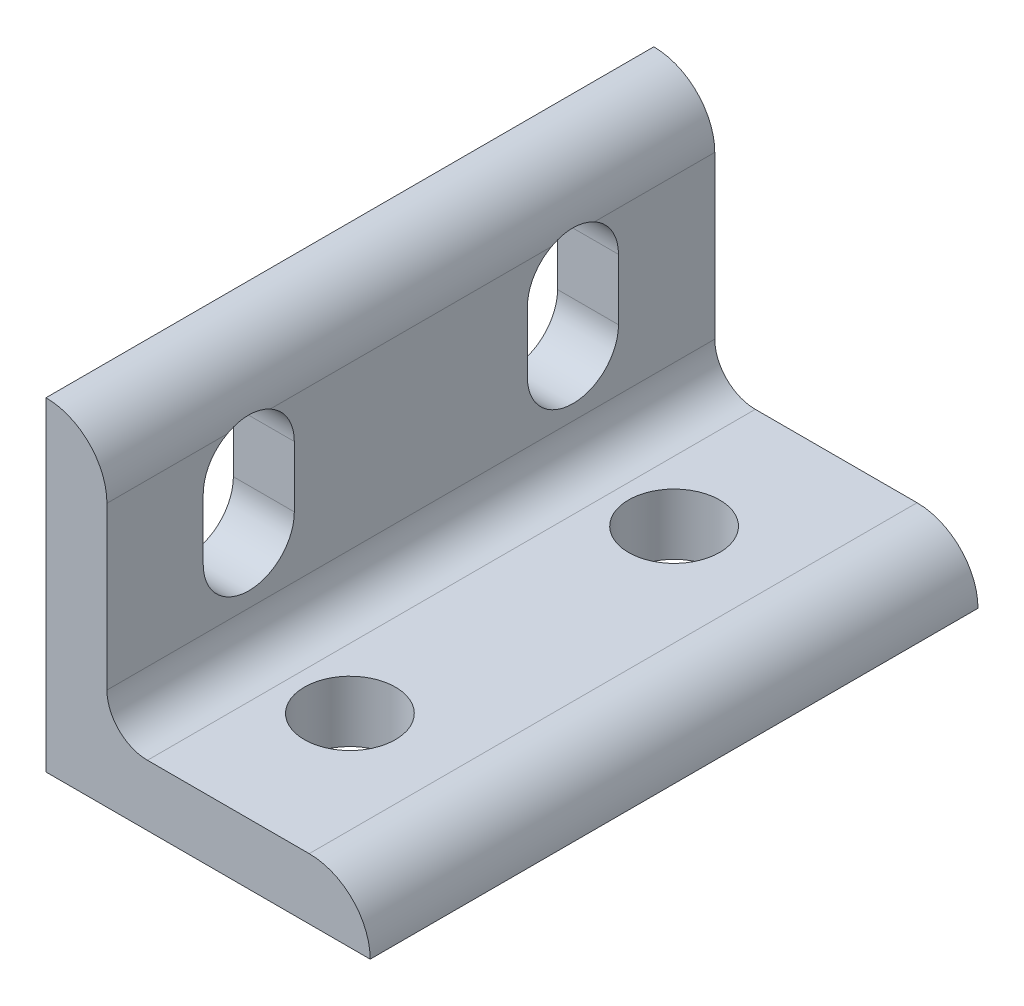
ISO-10303-21;
HEADER;
FILE_DESCRIPTION(('STEP AP214'),'2;1');
FILE_NAME('part.step','',(''),(''),'','','');
FILE_SCHEMA(('AUTOMOTIVE_DESIGN { 1 0 10303 214 1 1 1 1 }'));
ENDSEC;
DATA;
#1=APPLICATION_CONTEXT('core data for automotive mechanical design processes');
#2=APPLICATION_PROTOCOL_DEFINITION('international standard','automotive_design',2000,#1);
#3=PRODUCT_CONTEXT('',#1,'mechanical');
#4=PRODUCT('Part','Part','',(#3));
#5=PRODUCT_RELATED_PRODUCT_CATEGORY('part','',(#4));
#6=PRODUCT_DEFINITION_FORMATION('','',#4);
#7=PRODUCT_DEFINITION_CONTEXT('part definition',#1,'design');
#8=PRODUCT_DEFINITION('design','',#6,#7);
#9=PRODUCT_DEFINITION_SHAPE('','',#8);
#10=(LENGTH_UNIT() NAMED_UNIT(*) SI_UNIT(.MILLI.,.METRE.));
#11=(NAMED_UNIT(*) PLANE_ANGLE_UNIT() SI_UNIT($,.RADIAN.));
#12=(NAMED_UNIT(*) SI_UNIT($,.STERADIAN.) SOLID_ANGLE_UNIT());
#13=UNCERTAINTY_MEASURE_WITH_UNIT(LENGTH_MEASURE(1.E-05),#10,'distance_accuracy_value','');
#14=(GEOMETRIC_REPRESENTATION_CONTEXT(3) GLOBAL_UNCERTAINTY_ASSIGNED_CONTEXT((#13)) GLOBAL_UNIT_ASSIGNED_CONTEXT((#10,
#11,#12)) REPRESENTATION_CONTEXT('',''));
#15=CARTESIAN_POINT('',(0.,0.,0.));
#16=DIRECTION('',(0.,0.,1.));
#17=DIRECTION('',(1.,0.,0.));
#18=AXIS2_PLACEMENT_3D('',#15,#16,#17);
#19=CARTESIAN_POINT('',(-12.7,7.9248,-23.8125));
#20=DIRECTION('',(0.,0.,1.));
#21=DIRECTION('',(1.,0.,0.));
#22=AXIS2_PLACEMENT_3D('',#19,#20,#21);
#23=CYLINDRICAL_SURFACE('',#22,4.7752);
#24=CARTESIAN_POINT('',(-7.9248,7.9248,11.0220132509462));
#25=CARTESIAN_POINT('',(-7.92481560049592,7.97198264026627,11.1105530499581));
#26=CARTESIAN_POINT('',(-7.92550012205361,8.01540977478819,11.2010856695941));
#27=CARTESIAN_POINT('',(-7.92764776843833,8.0944880787926,11.3854704138337));
#28=CARTESIAN_POINT('',(-7.929110840339,8.13013977662214,11.4793223123857));
#29=CARTESIAN_POINT('',(-7.93225439032208,8.19336625267331,11.6695638568773));
#30=CARTESIAN_POINT('',(-7.93393457377953,8.22095181424074,11.7659499252254));
#31=CARTESIAN_POINT('',(-7.93708478391002,8.26791971032118,11.960702632401));
#32=CARTESIAN_POINT('',(-7.93855481380049,8.28730217043143,12.0590692408804));
#33=CARTESIAN_POINT('',(-7.94096961658513,8.31773484760735,12.2571525031942));
#34=CARTESIAN_POINT('',(-7.94191406229188,8.32877987596424,12.3568699584881));
#35=CARTESIAN_POINT('',(-7.94309359017064,8.3424409536407,12.5569310344266));
#36=CARTESIAN_POINT('',(-7.94332834804512,8.34505314954708,12.6572749203435));
#37=CARTESIAN_POINT('',(-7.94304377497829,8.341819075309,12.8578030712449));
#38=CARTESIAN_POINT('',(-7.94252460460013,8.33597460617069,12.9579873656688));
#39=CARTESIAN_POINT('',(-7.94083039182643,8.31587724756712,13.1574567845667));
#40=CARTESIAN_POINT('',(-7.93965566575332,8.30162841323472,13.2567423192529));
#41=CARTESIAN_POINT('',(-7.93701861799582,8.26658902460885,13.4443374260927));
#42=CARTESIAN_POINT('',(-7.93559448865452,8.24655339572945,13.5327894882935));
#43=CARTESIAN_POINT('',(-7.9326683654564,8.19981049650334,13.707906238063));
#44=CARTESIAN_POINT('',(-7.93116637764446,8.17310374348454,13.7945710636631));
#45=CARTESIAN_POINT('',(-7.92842086118506,8.11314773705982,13.9656796838601));
#46=CARTESIAN_POINT('',(-7.92717751363214,8.07989393104251,14.0501218863291));
#47=CARTESIAN_POINT('',(-7.9253721376969,8.00704969992215,14.2162479649546));
#48=CARTESIAN_POINT('',(-7.92481020248326,7.96745840914011,14.2979314624328));
#49=CARTESIAN_POINT('',(-7.9248,7.9248,14.3779867490538));
#50=B_SPLINE_CURVE_WITH_KNOTS('',3,(#24,#25,#26,#27,#28,#29,#30,#31,#32,#33,#34,#35,#36,#37,#38,
#39,#40,#41,#42,#43,#44,#45,#46,#47,#48,#49),.UNSPECIFIED.,.F.,.F.,(4,2,2,2,2,2,2,2,2,2,2,2,4),
(0.,0.300879588223927,0.601738725068878,0.902193795053615,1.20264426462114,1.5032815624204,
1.80405621808538,2.1047668275479,2.40533246174311,2.67718634841712,2.94901916008735,
3.22104166750748,3.49310136403919),.UNSPECIFIED.);
#51=CARTESIAN_POINT('',(-7.9248,7.9248,11.0220132509462));
#52=VERTEX_POINT('',#51);
#53=CARTESIAN_POINT('',(-7.9248,7.9248,14.3779867490538));
#54=VERTEX_POINT('',#53);
#55=EDGE_CURVE('E347',#52,#54,#50,.T.);
#56=ORIENTED_EDGE('',*,*,#55,.F.);
#57=DIRECTION('',(0.,0.,1.));
#58=VECTOR('',#57,1.);
#59=CARTESIAN_POINT('',(-7.9248,7.9248,-23.8125));
#60=LINE('',#59,#58);
#61=CARTESIAN_POINT('',(-7.9248,7.9248,-11.0220132509462));
#62=VERTEX_POINT('',#61);
#63=EDGE_CURVE('E57',#62,#52,#60,.T.);
#64=ORIENTED_EDGE('',*,*,#63,.F.);
#65=CARTESIAN_POINT('',(-7.9248,7.9248,-14.3779867490538));
#66=CARTESIAN_POINT('',(-7.92481560049592,7.97198264026627,-14.2894469500419));
#67=CARTESIAN_POINT('',(-7.92550012205361,8.01540977478819,-14.1989143304059));
#68=CARTESIAN_POINT('',(-7.92764776843833,8.0944880787926,-14.0145295861663));
#69=CARTESIAN_POINT('',(-7.929110840339,8.13013977662214,-13.9206776876143));
#70=CARTESIAN_POINT('',(-7.93225439032208,8.19336625267331,-13.7304361431227));
#71=CARTESIAN_POINT('',(-7.93393457377953,8.22095181424073,-13.6340500747746));
#72=CARTESIAN_POINT('',(-7.93708478391002,8.26791971032118,-13.439297367599));
#73=CARTESIAN_POINT('',(-7.93855481380048,8.28730217043143,-13.3409307591196));
#74=CARTESIAN_POINT('',(-7.94096961658513,8.31773484760735,-13.1428474968058));
#75=CARTESIAN_POINT('',(-7.94191406229188,8.32877987596424,-13.0431300415119));
#76=CARTESIAN_POINT('',(-7.94309359017064,8.3424409536407,-12.8430689655734));
#77=CARTESIAN_POINT('',(-7.94332834804512,8.34505314954708,-12.7427250796565));
#78=CARTESIAN_POINT('',(-7.94304377497829,8.341819075309,-12.5421969287551));
#79=CARTESIAN_POINT('',(-7.94252460460013,8.33597460617069,-12.4420126343312));
#80=CARTESIAN_POINT('',(-7.94083039182643,8.31587724756712,-12.2425432154333));
#81=CARTESIAN_POINT('',(-7.93965566575332,8.30162841323472,-12.1432576807471));
#82=CARTESIAN_POINT('',(-7.93701861799582,8.26658902460885,-11.9556625739073));
#83=CARTESIAN_POINT('',(-7.93559448865452,8.24655339572945,-11.8672105117065));
#84=CARTESIAN_POINT('',(-7.9326683654564,8.19981049650334,-11.692093761937));
#85=CARTESIAN_POINT('',(-7.93116637764446,8.17310374348454,-11.6054289363369));
#86=CARTESIAN_POINT('',(-7.92842086118506,8.11314773705982,-11.4343203161399));
#87=CARTESIAN_POINT('',(-7.92717751363214,8.07989393104252,-11.3498781136709));
#88=CARTESIAN_POINT('',(-7.9253721376969,8.00704969992215,-11.1837520350454));
#89=CARTESIAN_POINT('',(-7.92481020248326,7.96745840914012,-11.1020685375672));
#90=CARTESIAN_POINT('',(-7.9248,7.9248,-11.0220132509462));
#91=B_SPLINE_CURVE_WITH_KNOTS('',3,(#65,#66,#67,#68,#69,#70,#71,#72,#73,#74,#75,#76,#77,#78,#79,
#80,#81,#82,#83,#84,#85,#86,#87,#88,#89,#90),.UNSPECIFIED.,.F.,.F.,(4,2,2,2,2,2,2,2,2,2,2,2,4),
(0.,0.300879588223929,0.601738725068878,0.902193795053614,1.20264426462114,1.5032815624204,
1.80405621808538,2.1047668275479,2.40533246174311,2.67718634841712,2.94901916008736,
3.22104166750748,3.49310136403919),.UNSPECIFIED.);
#92=CARTESIAN_POINT('',(-7.9248,7.9248,-14.3779867490538));
#93=VERTEX_POINT('',#92);
#94=EDGE_CURVE('E291',#93,#62,#91,.T.);
#95=ORIENTED_EDGE('',*,*,#94,.F.);
#96=CARTESIAN_POINT('',(-7.9248,7.9248,-23.8125));
#97=VERTEX_POINT('',#96);
#98=EDGE_CURVE('E11',#97,#93,#60,.T.);
#99=ORIENTED_EDGE('',*,*,#98,.F.);
#100=CARTESIAN_POINT('',(-12.7,7.9248,-23.8125));
#101=DIRECTION('',(0.,0.,1.));
#102=DIRECTION('',(1.,0.,0.));
#103=AXIS2_PLACEMENT_3D('',#100,#101,#102);
#104=CIRCLE('',#103,4.7752);
#105=CARTESIAN_POINT('',(-12.7,12.7,-23.8125));
#106=VERTEX_POINT('',#105);
#107=EDGE_CURVE('E414',#97,#106,#104,.T.);
#108=ORIENTED_EDGE('',*,*,#107,.T.);
#109=DIRECTION('',(0.,0.,1.));
#110=VECTOR('',#109,1.);
#111=CARTESIAN_POINT('',(-12.7,12.7,-23.8125));
#112=LINE('',#111,#110);
#113=CARTESIAN_POINT('',(-12.7,12.7,23.8125));
#114=VERTEX_POINT('',#113);
#115=EDGE_CURVE('E51',#106,#114,#112,.T.);
#116=ORIENTED_EDGE('',*,*,#115,.T.);
#117=CARTESIAN_POINT('',(-12.7,7.9248,23.8125));
#118=DIRECTION('',(0.,0.,1.));
#119=DIRECTION('',(1.,0.,0.));
#120=AXIS2_PLACEMENT_3D('',#117,#118,#119);
#121=CIRCLE('',#120,4.7752);
#122=CARTESIAN_POINT('',(-7.9248,7.9248,23.8125));
#123=VERTEX_POINT('',#122);
#124=EDGE_CURVE('E439',#123,#114,#121,.T.);
#125=ORIENTED_EDGE('',*,*,#124,.F.);
#126=EDGE_CURVE('E59',#54,#123,#60,.T.);
#127=ORIENTED_EDGE('',*,*,#126,.F.);
#128=EDGE_LOOP('',(#56,#64,#95,#99,#108,#116,#125,#127));
#129=FACE_BOUND('',#128,.T.);
#130=ADVANCED_FACE('F47',(#129),#23,.T.);
#131=CARTESIAN_POINT('',(-7.9248,-4.7498,-23.8125));
#132=DIRECTION('',(1.,0.,0.));
#133=DIRECTION('',(0.,0.,-1.));
#134=AXIS2_PLACEMENT_3D('',#131,#132,#133);
#135=PLANE('',#134);
#136=CARTESIAN_POINT('',(-7.9248,4.7752,12.7));
#137=DIRECTION('',(1.,0.,0.));
#138=DIRECTION('',(0.,0.,-1.));
#139=AXIS2_PLACEMENT_3D('',#136,#137,#138);
#140=CIRCLE('',#139,3.5687);
#141=CARTESIAN_POINT('',(-7.9248,4.7752,9.1313));
#142=VERTEX_POINT('',#141);
#143=EDGE_CURVE('E352',#142,#52,#140,.T.);
#144=ORIENTED_EDGE('',*,*,#143,.F.);
#145=DIRECTION('',(0.,1.,0.));
#146=VECTOR('',#145,1.);
#147=CARTESIAN_POINT('',(-7.9248,-4.74979999999999,9.13129999999999));
#148=LINE('',#147,#146);
#149=CARTESIAN_POINT('',(-7.9248,0.,9.1313));
#150=VERTEX_POINT('',#149);
#151=EDGE_CURVE('E474',#150,#142,#148,.T.);
#152=ORIENTED_EDGE('',*,*,#151,.F.);
#153=CARTESIAN_POINT('',(-7.9248,0.,12.7));
#154=DIRECTION('',(1.,0.,0.));
#155=DIRECTION('',(0.,0.,-1.));
#156=AXIS2_PLACEMENT_3D('',#153,#154,#155);
#157=CIRCLE('',#156,3.5687);
#158=CARTESIAN_POINT('',(-7.9248,0.,16.2687));
#159=VERTEX_POINT('',#158);
#160=EDGE_CURVE('E471',#159,#150,#157,.T.);
#161=ORIENTED_EDGE('',*,*,#160,.F.);
#162=DIRECTION('',(0.,-1.,0.));
#163=VECTOR('',#162,1.);
#164=CARTESIAN_POINT('',(-7.9248,-4.7498,16.2687));
#165=LINE('',#164,#163);
#166=CARTESIAN_POINT('',(-7.9248,4.7752,16.2687));
#167=VERTEX_POINT('',#166);
#168=EDGE_CURVE('E300',#167,#159,#165,.T.);
#169=ORIENTED_EDGE('',*,*,#168,.F.);
#170=EDGE_CURVE('E208',#54,#167,#140,.T.);
#171=ORIENTED_EDGE('',*,*,#170,.F.);
#172=ORIENTED_EDGE('',*,*,#126,.T.);
#173=DIRECTION('',(0.,1.,0.));
#174=VECTOR('',#173,1.);
#175=CARTESIAN_POINT('',(-7.9248,-4.7498,23.8125));
#176=LINE('',#175,#174);
#177=CARTESIAN_POINT('',(-7.9248,-4.7498,23.8125));
#178=VERTEX_POINT('',#177);
#179=EDGE_CURVE('E417',#178,#123,#176,.T.);
#180=ORIENTED_EDGE('',*,*,#179,.F.);
#181=DIRECTION('',(0.,0.,1.));
#182=VECTOR('',#181,1.);
#183=CARTESIAN_POINT('',(-7.9248,-4.7498,-23.8125));
#184=LINE('',#183,#182);
#185=CARTESIAN_POINT('',(-7.9248,-4.7498,-23.8125));
#186=VERTEX_POINT('',#185);
#187=EDGE_CURVE('E362',#186,#178,#184,.T.);
#188=ORIENTED_EDGE('',*,*,#187,.F.);
#189=DIRECTION('',(0.,1.,0.));
#190=VECTOR('',#189,1.);
#191=CARTESIAN_POINT('',(-7.9248,-4.7498,-23.8125));
#192=LINE('',#191,#190);
#193=EDGE_CURVE('E365',#186,#97,#192,.T.);
#194=ORIENTED_EDGE('',*,*,#193,.T.);
#195=ORIENTED_EDGE('',*,*,#98,.T.);
#196=CARTESIAN_POINT('',(-7.9248,4.7752,-12.7));
#197=DIRECTION('',(1.,0.,0.));
#198=DIRECTION('',(0.,0.,-1.));
#199=AXIS2_PLACEMENT_3D('',#196,#197,#198);
#200=CIRCLE('',#199,3.5687);
#201=CARTESIAN_POINT('',(-7.9248,4.7752,-16.2687));
#202=VERTEX_POINT('',#201);
#203=EDGE_CURVE('E292',#202,#93,#200,.T.);
#204=ORIENTED_EDGE('',*,*,#203,.F.);
#205=DIRECTION('',(0.,1.,0.));
#206=VECTOR('',#205,1.);
#207=CARTESIAN_POINT('',(-7.9248,-4.7498,-16.2687));
#208=LINE('',#207,#206);
#209=CARTESIAN_POINT('',(-7.9248,0.,-16.2687));
#210=VERTEX_POINT('',#209);
#211=EDGE_CURVE('E285',#210,#202,#208,.T.);
#212=ORIENTED_EDGE('',*,*,#211,.F.);
#213=CARTESIAN_POINT('',(-7.9248,0.,-12.7));
#214=DIRECTION('',(1.,0.,0.));
#215=DIRECTION('',(0.,0.,-1.));
#216=AXIS2_PLACEMENT_3D('',#213,#214,#215);
#217=CIRCLE('',#216,3.5687);
#218=CARTESIAN_POINT('',(-7.9248,0.,-9.1313));
#219=VERTEX_POINT('',#218);
#220=EDGE_CURVE('E282',#219,#210,#217,.T.);
#221=ORIENTED_EDGE('',*,*,#220,.F.);
#222=DIRECTION('',(0.,-1.,0.));
#223=VECTOR('',#222,1.);
#224=CARTESIAN_POINT('',(-7.9248,-4.74980000000001,-9.1313));
#225=LINE('',#224,#223);
#226=CARTESIAN_POINT('',(-7.9248,4.7752,-9.1313));
#227=VERTEX_POINT('',#226);
#228=EDGE_CURVE('E247',#227,#219,#225,.T.);
#229=ORIENTED_EDGE('',*,*,#228,.F.);
#230=EDGE_CURVE('E288',#62,#227,#200,.T.);
#231=ORIENTED_EDGE('',*,*,#230,.F.);
#232=ORIENTED_EDGE('',*,*,#63,.T.);
#233=EDGE_LOOP('',(#144,#152,#161,#169,#171,#172,#180,#188,#194,#195,#204,#212,#221,#229,#231,#232));
#234=FACE_BOUND('',#233,.T.);
#235=ADVANCED_FACE('F319',(#234),#135,.T.);
#236=CARTESIAN_POINT('',(-4.7498,-4.7498,-23.8125));
#237=DIRECTION('',(0.,0.,1.));
#238=DIRECTION('',(1.,0.,0.));
#239=AXIS2_PLACEMENT_3D('',#236,#237,#238);
#240=CYLINDRICAL_SURFACE('',#239,3.175);
#241=ORIENTED_EDGE('',*,*,#187,.T.);
#242=CARTESIAN_POINT('',(-4.7498,-4.7498,23.8125));
#243=DIRECTION('',(0.,0.,-1.));
#244=DIRECTION('',(-1.,0.,0.));
#245=AXIS2_PLACEMENT_3D('',#242,#243,#244);
#246=CIRCLE('',#245,3.175);
#247=CARTESIAN_POINT('',(-4.7498,-7.9248,23.8125));
#248=VERTEX_POINT('',#247);
#249=EDGE_CURVE('E421',#248,#178,#246,.T.);
#250=ORIENTED_EDGE('',*,*,#249,.F.);
#251=DIRECTION('',(0.,0.,1.));
#252=VECTOR('',#251,1.);
#253=CARTESIAN_POINT('',(-4.7498,-7.9248,-23.8125));
#254=LINE('',#253,#252);
#255=CARTESIAN_POINT('',(-4.7498,-7.9248,-23.8125));
#256=VERTEX_POINT('',#255);
#257=EDGE_CURVE('E368',#256,#248,#254,.T.);
#258=ORIENTED_EDGE('',*,*,#257,.F.);
#259=CARTESIAN_POINT('',(-4.7498,-4.7498,-23.8125));
#260=DIRECTION('',(0.,0.,-1.));
#261=DIRECTION('',(-1.,0.,0.));
#262=AXIS2_PLACEMENT_3D('',#259,#260,#261);
#263=CIRCLE('',#262,3.175);
#264=EDGE_CURVE('E390',#256,#186,#263,.T.);
#265=ORIENTED_EDGE('',*,*,#264,.T.);
#266=EDGE_LOOP('',(#241,#250,#258,#265));
#267=FACE_BOUND('',#266,.T.);
#268=ADVANCED_FACE('F322',(#267),#240,.F.);
#269=CARTESIAN_POINT('',(7.9248,-7.9248,-23.8125));
#270=DIRECTION('',(0.,1.,0.));
#271=DIRECTION('',(-1.,0.,0.));
#272=AXIS2_PLACEMENT_3D('',#269,#270,#271);
#273=PLANE('',#272);
#274=CARTESIAN_POINT('',(0.,-7.9248,12.7));
#275=DIRECTION('',(0.,1.,0.));
#276=DIRECTION('',(-1.,0.,0.));
#277=AXIS2_PLACEMENT_3D('',#274,#275,#276);
#278=CIRCLE('',#277,3.5687);
#279=CARTESIAN_POINT('',(-3.5687,-7.9248,12.7));
#280=VERTEX_POINT('',#279);
#281=EDGE_CURVE('E521',#280,#280,#278,.T.);
#282=ORIENTED_EDGE('',*,*,#281,.F.);
#283=EDGE_LOOP('',(#282));
#284=FACE_BOUND('',#283,.T.);
#285=CARTESIAN_POINT('',(0.,-7.9248,-12.7));
#286=DIRECTION('',(0.,1.,0.));
#287=DIRECTION('',(1.,0.,0.));
#288=AXIS2_PLACEMENT_3D('',#285,#286,#287);
#289=CIRCLE('',#288,3.5687);
#290=CARTESIAN_POINT('',(3.56870000000001,-7.9248,-12.7));
#291=VERTEX_POINT('',#290);
#292=EDGE_CURVE('E238',#291,#291,#289,.T.);
#293=ORIENTED_EDGE('',*,*,#292,.F.);
#294=EDGE_LOOP('',(#293));
#295=FACE_BOUND('',#294,.T.);
#296=ORIENTED_EDGE('',*,*,#257,.T.);
#297=DIRECTION('',(-1.,0.,0.));
#298=VECTOR('',#297,1.);
#299=CARTESIAN_POINT('',(7.9248,-7.9248,23.8125));
#300=LINE('',#299,#298);
#301=CARTESIAN_POINT('',(7.9248,-7.9248,23.8125));
#302=VERTEX_POINT('',#301);
#303=EDGE_CURVE('E425',#302,#248,#300,.T.);
#304=ORIENTED_EDGE('',*,*,#303,.F.);
#305=DIRECTION('',(0.,0.,1.));
#306=VECTOR('',#305,1.);
#307=CARTESIAN_POINT('',(7.9248,-7.9248,-23.8125));
#308=LINE('',#307,#306);
#309=CARTESIAN_POINT('',(7.9248,-7.9248,-23.8125));
#310=VERTEX_POINT('',#309);
#311=EDGE_CURVE('E371',#310,#302,#308,.T.);
#312=ORIENTED_EDGE('',*,*,#311,.F.);
#313=DIRECTION('',(-1.,0.,0.));
#314=VECTOR('',#313,1.);
#315=CARTESIAN_POINT('',(7.9248,-7.9248,-23.8125));
#316=LINE('',#315,#314);
#317=EDGE_CURVE('E396',#310,#256,#316,.T.);
#318=ORIENTED_EDGE('',*,*,#317,.T.);
#319=EDGE_LOOP('',(#296,#304,#312,#318));
#320=FACE_BOUND('',#319,.T.);
#321=ADVANCED_FACE('F326',(#284,#295,#320),#273,.T.);
#322=CARTESIAN_POINT('',(7.9248,-12.7,-23.8125));
#323=DIRECTION('',(0.,0.,1.));
#324=DIRECTION('',(1.,0.,0.));
#325=AXIS2_PLACEMENT_3D('',#322,#323,#324);
#326=CYLINDRICAL_SURFACE('',#325,4.7752);
#327=ORIENTED_EDGE('',*,*,#311,.T.);
#328=CARTESIAN_POINT('',(7.9248,-12.7,23.8125));
#329=DIRECTION('',(0.,0.,1.));
#330=DIRECTION('',(-1.,0.,0.));
#331=AXIS2_PLACEMENT_3D('',#328,#329,#330);
#332=CIRCLE('',#331,4.7752);
#333=CARTESIAN_POINT('',(12.7,-12.7,23.8125));
#334=VERTEX_POINT('',#333);
#335=EDGE_CURVE('E428',#334,#302,#332,.T.);
#336=ORIENTED_EDGE('',*,*,#335,.F.);
#337=DIRECTION('',(0.,0.,1.));
#338=VECTOR('',#337,1.);
#339=CARTESIAN_POINT('',(12.7,-12.7,-23.8125));
#340=LINE('',#339,#338);
#341=CARTESIAN_POINT('',(12.7,-12.7,-23.8125));
#342=VERTEX_POINT('',#341);
#343=EDGE_CURVE('E374',#342,#334,#340,.T.);
#344=ORIENTED_EDGE('',*,*,#343,.F.);
#345=CARTESIAN_POINT('',(7.9248,-12.7,-23.8125));
#346=DIRECTION('',(0.,0.,1.));
#347=DIRECTION('',(-1.,0.,0.));
#348=AXIS2_PLACEMENT_3D('',#345,#346,#347);
#349=CIRCLE('',#348,4.7752);
#350=EDGE_CURVE('E402',#342,#310,#349,.T.);
#351=ORIENTED_EDGE('',*,*,#350,.T.);
#352=EDGE_LOOP('',(#327,#336,#344,#351));
#353=FACE_BOUND('',#352,.T.);
#354=ADVANCED_FACE('F330',(#353),#326,.T.);
#355=CARTESIAN_POINT('',(-12.7,-12.7,-23.8125));
#356=DIRECTION('',(0.,-1.,0.));
#357=DIRECTION('',(0.,0.,-1.));
#358=AXIS2_PLACEMENT_3D('',#355,#356,#357);
#359=PLANE('',#358);
#360=CARTESIAN_POINT('',(0.,-12.7,12.7));
#361=DIRECTION('',(0.,1.,0.));
#362=DIRECTION('',(-1.,0.,0.));
#363=AXIS2_PLACEMENT_3D('',#360,#361,#362);
#364=CIRCLE('',#363,3.5687);
#365=CARTESIAN_POINT('',(-3.5687,-12.7,12.7));
#366=VERTEX_POINT('',#365);
#367=EDGE_CURVE('E259',#366,#366,#364,.T.);
#368=ORIENTED_EDGE('',*,*,#367,.T.);
#369=EDGE_LOOP('',(#368));
#370=FACE_BOUND('',#369,.T.);
#371=CARTESIAN_POINT('',(0.,-12.7,-12.7));
#372=DIRECTION('',(0.,1.,0.));
#373=DIRECTION('',(1.,0.,0.));
#374=AXIS2_PLACEMENT_3D('',#371,#372,#373);
#375=CIRCLE('',#374,3.5687);
#376=CARTESIAN_POINT('',(3.56870000000001,-12.7,-12.7));
#377=VERTEX_POINT('',#376);
#378=EDGE_CURVE('E522',#377,#377,#375,.T.);
#379=ORIENTED_EDGE('',*,*,#378,.T.);
#380=EDGE_LOOP('',(#379));
#381=FACE_BOUND('',#380,.T.);
#382=ORIENTED_EDGE('',*,*,#343,.T.);
#383=DIRECTION('',(1.,0.,0.));
#384=VECTOR('',#383,1.);
#385=CARTESIAN_POINT('',(-12.7,-12.7,23.8125));
#386=LINE('',#385,#384);
#387=CARTESIAN_POINT('',(-12.7,-12.7,23.8125));
#388=VERTEX_POINT('',#387);
#389=EDGE_CURVE('E432',#388,#334,#386,.T.);
#390=ORIENTED_EDGE('',*,*,#389,.F.);
#391=DIRECTION('',(0.,0.,1.));
#392=VECTOR('',#391,1.);
#393=CARTESIAN_POINT('',(-12.7,-12.7,-23.8125));
#394=LINE('',#393,#392);
#395=CARTESIAN_POINT('',(-12.7,-12.7,-23.8125));
#396=VERTEX_POINT('',#395);
#397=EDGE_CURVE('E376',#396,#388,#394,.T.);
#398=ORIENTED_EDGE('',*,*,#397,.F.);
#399=DIRECTION('',(1.,0.,0.));
#400=VECTOR('',#399,1.);
#401=CARTESIAN_POINT('',(-12.7,-12.7,-23.8125));
#402=LINE('',#401,#400);
#403=EDGE_CURVE('E408',#396,#342,#402,.T.);
#404=ORIENTED_EDGE('',*,*,#403,.T.);
#405=EDGE_LOOP('',(#382,#390,#398,#404));
#406=FACE_BOUND('',#405,.T.);
#407=ADVANCED_FACE('F334',(#370,#381,#406),#359,.T.);
#408=CARTESIAN_POINT('',(-12.7,12.7,-23.8125));
#409=DIRECTION('',(-1.,0.,0.));
#410=DIRECTION('',(0.,0.,1.));
#411=AXIS2_PLACEMENT_3D('',#408,#409,#410);
#412=PLANE('',#411);
#413=CARTESIAN_POINT('',(-12.7,4.7752,12.7));
#414=DIRECTION('',(1.,0.,0.));
#415=DIRECTION('',(0.,0.,-1.));
#416=AXIS2_PLACEMENT_3D('',#413,#414,#415);
#417=CIRCLE('',#416,3.5687);
#418=CARTESIAN_POINT('',(-12.7,4.7752,9.1313));
#419=VERTEX_POINT('',#418);
#420=CARTESIAN_POINT('',(-12.7,4.7752,16.2687));
#421=VERTEX_POINT('',#420);
#422=EDGE_CURVE('E205',#419,#421,#417,.T.);
#423=ORIENTED_EDGE('',*,*,#422,.T.);
#424=DIRECTION('',(0.,-1.,0.));
#425=VECTOR('',#424,1.);
#426=CARTESIAN_POINT('',(-12.7,4.7752,16.2687));
#427=LINE('',#426,#425);
#428=CARTESIAN_POINT('',(-12.7,0.,16.2687));
#429=VERTEX_POINT('',#428);
#430=EDGE_CURVE('E216',#421,#429,#427,.T.);
#431=ORIENTED_EDGE('',*,*,#430,.T.);
#432=CARTESIAN_POINT('',(-12.7,0.,12.7));
#433=DIRECTION('',(1.,0.,0.));
#434=DIRECTION('',(0.,0.,-1.));
#435=AXIS2_PLACEMENT_3D('',#432,#433,#434);
#436=CIRCLE('',#435,3.5687);
#437=CARTESIAN_POINT('',(-12.7,0.,9.1313));
#438=VERTEX_POINT('',#437);
#439=EDGE_CURVE('E222',#429,#438,#436,.T.);
#440=ORIENTED_EDGE('',*,*,#439,.T.);
#441=DIRECTION('',(0.,1.,0.));
#442=VECTOR('',#441,1.);
#443=CARTESIAN_POINT('',(-12.7,4.7752,9.1313));
#444=LINE('',#443,#442);
#445=EDGE_CURVE('E212',#438,#419,#444,.T.);
#446=ORIENTED_EDGE('',*,*,#445,.T.);
#447=EDGE_LOOP('',(#423,#431,#440,#446));
#448=FACE_BOUND('',#447,.T.);
#449=CARTESIAN_POINT('',(-12.7,4.7752,-12.7));
#450=DIRECTION('',(1.,0.,0.));
#451=DIRECTION('',(0.,0.,1.));
#452=AXIS2_PLACEMENT_3D('',#449,#450,#451);
#453=CIRCLE('',#452,3.5687);
#454=CARTESIAN_POINT('',(-12.7,4.7752,-16.2687));
#455=VERTEX_POINT('',#454);
#456=CARTESIAN_POINT('',(-12.7,4.7752,-9.1313));
#457=VERTEX_POINT('',#456);
#458=EDGE_CURVE('E254',#455,#457,#453,.T.);
#459=ORIENTED_EDGE('',*,*,#458,.T.);
#460=DIRECTION('',(0.,-1.,0.));
#461=VECTOR('',#460,1.);
#462=CARTESIAN_POINT('',(-12.7,4.7752,-9.1313));
#463=LINE('',#462,#461);
#464=CARTESIAN_POINT('',(-12.7,0.,-9.1313));
#465=VERTEX_POINT('',#464);
#466=EDGE_CURVE('E258',#457,#465,#463,.T.);
#467=ORIENTED_EDGE('',*,*,#466,.T.);
#468=CARTESIAN_POINT('',(-12.7,0.,-12.7));
#469=DIRECTION('',(1.,0.,0.));
#470=DIRECTION('',(0.,0.,1.));
#471=AXIS2_PLACEMENT_3D('',#468,#469,#470);
#472=CIRCLE('',#471,3.5687);
#473=CARTESIAN_POINT('',(-12.7,0.,-16.2687));
#474=VERTEX_POINT('',#473);
#475=EDGE_CURVE('E263',#465,#474,#472,.T.);
#476=ORIENTED_EDGE('',*,*,#475,.T.);
#477=DIRECTION('',(0.,1.,0.));
#478=VECTOR('',#477,1.);
#479=CARTESIAN_POINT('',(-12.7,4.7752,-16.2687));
#480=LINE('',#479,#478);
#481=EDGE_CURVE('E267',#474,#455,#480,.T.);
#482=ORIENTED_EDGE('',*,*,#481,.T.);
#483=EDGE_LOOP('',(#459,#467,#476,#482));
#484=FACE_BOUND('',#483,.T.);
#485=ORIENTED_EDGE('',*,*,#397,.T.);
#486=DIRECTION('',(0.,-1.,0.));
#487=VECTOR('',#486,1.);
#488=CARTESIAN_POINT('',(-12.7,12.7,23.8125));
#489=LINE('',#488,#487);
#490=EDGE_CURVE('E436',#114,#388,#489,.T.);
#491=ORIENTED_EDGE('',*,*,#490,.F.);
#492=ORIENTED_EDGE('',*,*,#115,.F.);
#493=DIRECTION('',(0.,-1.,0.));
#494=VECTOR('',#493,1.);
#495=CARTESIAN_POINT('',(-12.7,12.7,-23.8125));
#496=LINE('',#495,#494);
#497=EDGE_CURVE('E412',#106,#396,#496,.T.);
#498=ORIENTED_EDGE('',*,*,#497,.T.);
#499=EDGE_LOOP('',(#485,#491,#492,#498));
#500=FACE_BOUND('',#499,.T.);
#501=ADVANCED_FACE('F224',(#448,#484,#500),#412,.T.);
#502=CARTESIAN_POINT('',(-12.7,7.9248,-23.8125));
#503=DIRECTION('',(0.,0.,1.));
#504=DIRECTION('',(1.,0.,0.));
#505=AXIS2_PLACEMENT_3D('',#502,#503,#504);
#506=PLANE('',#505);
#507=ORIENTED_EDGE('',*,*,#107,.F.);
#508=ORIENTED_EDGE('',*,*,#193,.F.);
#509=ORIENTED_EDGE('',*,*,#264,.F.);
#510=ORIENTED_EDGE('',*,*,#317,.F.);
#511=ORIENTED_EDGE('',*,*,#350,.F.);
#512=ORIENTED_EDGE('',*,*,#403,.F.);
#513=ORIENTED_EDGE('',*,*,#497,.F.);
#514=EDGE_LOOP('',(#507,#508,#509,#510,#511,#512,#513));
#515=FACE_BOUND('',#514,.T.);
#516=ADVANCED_FACE('F314',(#515),#506,.F.);
#517=CARTESIAN_POINT('',(-12.7,7.9248,23.8125));
#518=DIRECTION('',(0.,0.,1.));
#519=DIRECTION('',(1.,0.,0.));
#520=AXIS2_PLACEMENT_3D('',#517,#518,#519);
#521=PLANE('',#520);
#522=ORIENTED_EDGE('',*,*,#124,.T.);
#523=ORIENTED_EDGE('',*,*,#490,.T.);
#524=ORIENTED_EDGE('',*,*,#389,.T.);
#525=ORIENTED_EDGE('',*,*,#335,.T.);
#526=ORIENTED_EDGE('',*,*,#303,.T.);
#527=ORIENTED_EDGE('',*,*,#249,.T.);
#528=ORIENTED_EDGE('',*,*,#179,.T.);
#529=EDGE_LOOP('',(#522,#523,#524,#525,#526,#527,#528));
#530=FACE_BOUND('',#529,.T.);
#531=ADVANCED_FACE('F308',(#530),#521,.T.);
#532=CARTESIAN_POINT('',(-12.7,4.7752,-12.7));
#533=DIRECTION('',(1.,0.,0.));
#534=DIRECTION('',(0.,0.,-1.));
#535=AXIS2_PLACEMENT_3D('',#532,#533,#534);
#536=CYLINDRICAL_SURFACE('',#535,3.5687);
#537=ORIENTED_EDGE('',*,*,#203,.T.);
#538=ORIENTED_EDGE('',*,*,#94,.T.);
#539=ORIENTED_EDGE('',*,*,#230,.T.);
#540=DIRECTION('',(1.,0.,0.));
#541=VECTOR('',#540,1.);
#542=CARTESIAN_POINT('',(-12.7,4.7752,-9.1313));
#543=LINE('',#542,#541);
#544=EDGE_CURVE('E80',#457,#227,#543,.T.);
#545=ORIENTED_EDGE('',*,*,#544,.F.);
#546=ORIENTED_EDGE('',*,*,#458,.F.);
#547=DIRECTION('',(1.,0.,0.));
#548=VECTOR('',#547,1.);
#549=CARTESIAN_POINT('',(-12.7,4.7752,-16.2687));
#550=LINE('',#549,#548);
#551=EDGE_CURVE('E228',#455,#202,#550,.T.);
#552=ORIENTED_EDGE('',*,*,#551,.T.);
#553=EDGE_LOOP('',(#537,#538,#539,#545,#546,#552));
#554=FACE_BOUND('',#553,.T.);
#555=ADVANCED_FACE('F302',(#554),#536,.F.);
#556=CARTESIAN_POINT('',(-12.7,4.7752,-16.2687));
#557=DIRECTION('',(0.,0.,-1.));
#558=DIRECTION('',(-1.,0.,0.));
#559=AXIS2_PLACEMENT_3D('',#556,#557,#558);
#560=PLANE('',#559);
#561=ORIENTED_EDGE('',*,*,#211,.T.);
#562=ORIENTED_EDGE('',*,*,#551,.F.);
#563=ORIENTED_EDGE('',*,*,#481,.F.);
#564=DIRECTION('',(1.,0.,0.));
#565=VECTOR('',#564,1.);
#566=CARTESIAN_POINT('',(-12.7,0.,-16.2687));
#567=LINE('',#566,#565);
#568=EDGE_CURVE('E235',#474,#210,#567,.T.);
#569=ORIENTED_EDGE('',*,*,#568,.T.);
#570=EDGE_LOOP('',(#561,#562,#563,#569));
#571=FACE_BOUND('',#570,.T.);
#572=ADVANCED_FACE('F307',(#571),#560,.F.);
#573=CARTESIAN_POINT('',(-12.7,0.,-12.7));
#574=DIRECTION('',(1.,0.,0.));
#575=DIRECTION('',(0.,0.,-1.));
#576=AXIS2_PLACEMENT_3D('',#573,#574,#575);
#577=CYLINDRICAL_SURFACE('',#576,3.5687);
#578=ORIENTED_EDGE('',*,*,#220,.T.);
#579=ORIENTED_EDGE('',*,*,#568,.F.);
#580=ORIENTED_EDGE('',*,*,#475,.F.);
#581=DIRECTION('',(1.,0.,0.));
#582=VECTOR('',#581,1.);
#583=CARTESIAN_POINT('',(-12.7,0.,-9.1313));
#584=LINE('',#583,#582);
#585=EDGE_CURVE('E274',#465,#219,#584,.T.);
#586=ORIENTED_EDGE('',*,*,#585,.T.);
#587=EDGE_LOOP('',(#578,#579,#580,#586));
#588=FACE_BOUND('',#587,.T.);
#589=ADVANCED_FACE('F456',(#588),#577,.F.);
#590=CARTESIAN_POINT('',(-12.7,4.7752,-9.1313));
#591=DIRECTION('',(0.,0.,1.));
#592=DIRECTION('',(0.,-1.,0.));
#593=AXIS2_PLACEMENT_3D('',#590,#591,#592);
#594=PLANE('',#593);
#595=ORIENTED_EDGE('',*,*,#228,.T.);
#596=ORIENTED_EDGE('',*,*,#585,.F.);
#597=ORIENTED_EDGE('',*,*,#466,.F.);
#598=ORIENTED_EDGE('',*,*,#544,.T.);
#599=EDGE_LOOP('',(#595,#596,#597,#598));
#600=FACE_BOUND('',#599,.T.);
#601=ADVANCED_FACE('F310',(#600),#594,.F.);
#602=CARTESIAN_POINT('',(-12.7,4.7752,12.7));
#603=DIRECTION('',(1.,0.,0.));
#604=DIRECTION('',(0.,0.,-1.));
#605=AXIS2_PLACEMENT_3D('',#602,#603,#604);
#606=CYLINDRICAL_SURFACE('',#605,3.5687);
#607=ORIENTED_EDGE('',*,*,#143,.T.);
#608=ORIENTED_EDGE('',*,*,#55,.T.);
#609=ORIENTED_EDGE('',*,*,#170,.T.);
#610=DIRECTION('',(1.,0.,0.));
#611=VECTOR('',#610,1.);
#612=CARTESIAN_POINT('',(-12.7,4.7752,16.2687));
#613=LINE('',#612,#611);
#614=EDGE_CURVE('E69',#421,#167,#613,.T.);
#615=ORIENTED_EDGE('',*,*,#614,.F.);
#616=ORIENTED_EDGE('',*,*,#422,.F.);
#617=DIRECTION('',(1.,0.,0.));
#618=VECTOR('',#617,1.);
#619=CARTESIAN_POINT('',(-12.7,4.7752,9.1313));
#620=LINE('',#619,#618);
#621=EDGE_CURVE('E245',#419,#142,#620,.T.);
#622=ORIENTED_EDGE('',*,*,#621,.T.);
#623=EDGE_LOOP('',(#607,#608,#609,#615,#616,#622));
#624=FACE_BOUND('',#623,.T.);
#625=ADVANCED_FACE('F202',(#624),#606,.F.);
#626=CARTESIAN_POINT('',(-12.7,4.7752,9.1313));
#627=DIRECTION('',(0.,0.,-1.));
#628=DIRECTION('',(0.,1.,0.));
#629=AXIS2_PLACEMENT_3D('',#626,#627,#628);
#630=PLANE('',#629);
#631=ORIENTED_EDGE('',*,*,#151,.T.);
#632=ORIENTED_EDGE('',*,*,#621,.F.);
#633=ORIENTED_EDGE('',*,*,#445,.F.);
#634=DIRECTION('',(1.,0.,0.));
#635=VECTOR('',#634,1.);
#636=CARTESIAN_POINT('',(-12.7,0.,9.1313));
#637=LINE('',#636,#635);
#638=EDGE_CURVE('E248',#438,#150,#637,.T.);
#639=ORIENTED_EDGE('',*,*,#638,.T.);
#640=EDGE_LOOP('',(#631,#632,#633,#639));
#641=FACE_BOUND('',#640,.T.);
#642=ADVANCED_FACE('F453',(#641),#630,.F.);
#643=CARTESIAN_POINT('',(-12.7,0.,12.7));
#644=DIRECTION('',(1.,0.,0.));
#645=DIRECTION('',(0.,0.,-1.));
#646=AXIS2_PLACEMENT_3D('',#643,#644,#645);
#647=CYLINDRICAL_SURFACE('',#646,3.5687);
#648=ORIENTED_EDGE('',*,*,#160,.T.);
#649=ORIENTED_EDGE('',*,*,#638,.F.);
#650=ORIENTED_EDGE('',*,*,#439,.F.);
#651=DIRECTION('',(1.,0.,0.));
#652=VECTOR('',#651,1.);
#653=CARTESIAN_POINT('',(-12.7,0.,16.2687));
#654=LINE('',#653,#652);
#655=EDGE_CURVE('E211',#429,#159,#654,.T.);
#656=ORIENTED_EDGE('',*,*,#655,.T.);
#657=EDGE_LOOP('',(#648,#649,#650,#656));
#658=FACE_BOUND('',#657,.T.);
#659=ADVANCED_FACE('F485',(#658),#647,.F.);
#660=CARTESIAN_POINT('',(-12.7,4.7752,16.2687));
#661=DIRECTION('',(0.,0.,1.));
#662=DIRECTION('',(1.,0.,0.));
#663=AXIS2_PLACEMENT_3D('',#660,#661,#662);
#664=PLANE('',#663);
#665=ORIENTED_EDGE('',*,*,#168,.T.);
#666=ORIENTED_EDGE('',*,*,#655,.F.);
#667=ORIENTED_EDGE('',*,*,#430,.F.);
#668=ORIENTED_EDGE('',*,*,#614,.T.);
#669=EDGE_LOOP('',(#665,#666,#667,#668));
#670=FACE_BOUND('',#669,.T.);
#671=ADVANCED_FACE('F217',(#670),#664,.F.);
#672=CARTESIAN_POINT('',(0.,-12.7,-12.7));
#673=DIRECTION('',(0.,1.,0.));
#674=DIRECTION('',(-1.,0.,0.));
#675=AXIS2_PLACEMENT_3D('',#672,#673,#674);
#676=CYLINDRICAL_SURFACE('',#675,3.5687);
#677=ORIENTED_EDGE('',*,*,#378,.F.);
#678=EDGE_LOOP('',(#677));
#679=FACE_BOUND('',#678,.T.);
#680=ORIENTED_EDGE('',*,*,#292,.T.);
#681=EDGE_LOOP('',(#680));
#682=FACE_BOUND('',#681,.T.);
#683=ADVANCED_FACE('F505',(#679,#682),#676,.F.);
#684=CARTESIAN_POINT('',(0.,-12.7,12.7));
#685=DIRECTION('',(0.,1.,0.));
#686=DIRECTION('',(-1.,0.,0.));
#687=AXIS2_PLACEMENT_3D('',#684,#685,#686);
#688=CYLINDRICAL_SURFACE('',#687,3.5687);
#689=ORIENTED_EDGE('',*,*,#367,.F.);
#690=EDGE_LOOP('',(#689));
#691=FACE_BOUND('',#690,.T.);
#692=ORIENTED_EDGE('',*,*,#281,.T.);
#693=EDGE_LOOP('',(#692));
#694=FACE_BOUND('',#693,.T.);
#695=ADVANCED_FACE('F509',(#691,#694),#688,.F.);
#696=CLOSED_SHELL('',(#130,#235,#268,#321,#354,#407,#501,#516,#531,#555,#572,#589,#601,#625,
#642,#659,#671,#683,#695));
#697=MANIFOLD_SOLID_BREP('B2',#696);
#698=ADVANCED_BREP_SHAPE_REPRESENTATION('',(#18,#697),#14);
#699=SHAPE_DEFINITION_REPRESENTATION(#9,#698);
ENDSEC;
END-ISO-10303-21;
